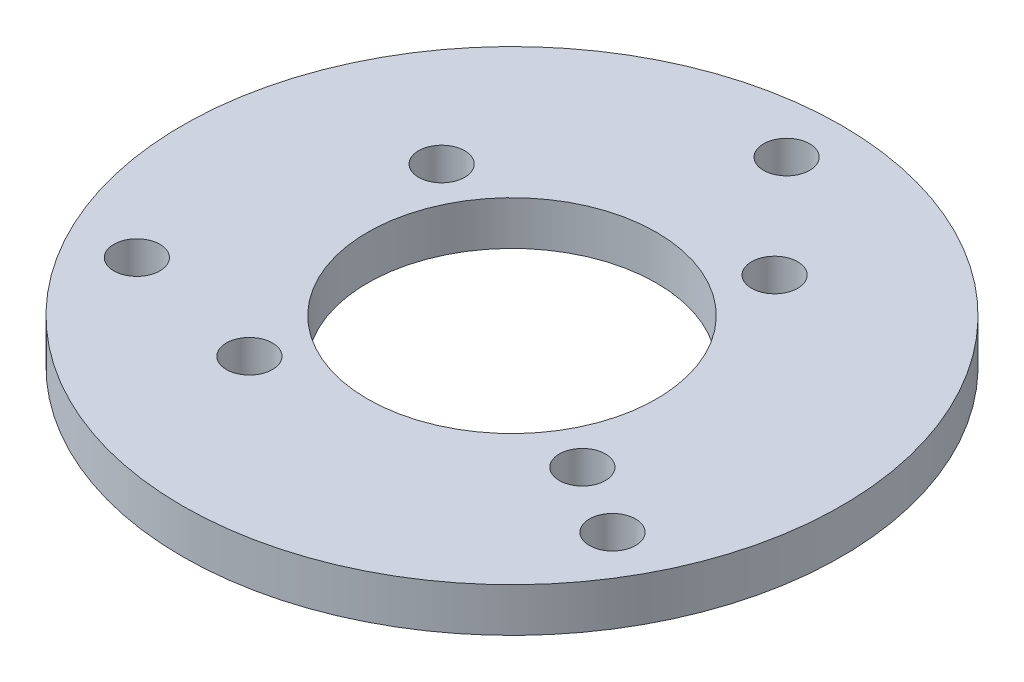
ISO-10303-21;
HEADER;
FILE_DESCRIPTION(('STEP AP214'),'2;1');
FILE_NAME('part.step','',(''),(''),'','','');
FILE_SCHEMA(('AUTOMOTIVE_DESIGN { 1 0 10303 214 1 1 1 1 }'));
ENDSEC;
DATA;
#1=APPLICATION_CONTEXT('core data for automotive mechanical design processes');
#2=APPLICATION_PROTOCOL_DEFINITION('international standard','automotive_design',2000,#1);
#3=PRODUCT_CONTEXT('',#1,'mechanical');
#4=PRODUCT('Part','Part','',(#3));
#5=PRODUCT_RELATED_PRODUCT_CATEGORY('part','',(#4));
#6=PRODUCT_DEFINITION_FORMATION('','',#4);
#7=PRODUCT_DEFINITION_CONTEXT('part definition',#1,'design');
#8=PRODUCT_DEFINITION('design','',#6,#7);
#9=PRODUCT_DEFINITION_SHAPE('','',#8);
#10=(LENGTH_UNIT() NAMED_UNIT(*) SI_UNIT(.MILLI.,.METRE.));
#11=(NAMED_UNIT(*) PLANE_ANGLE_UNIT() SI_UNIT($,.RADIAN.));
#12=(NAMED_UNIT(*) SI_UNIT($,.STERADIAN.) SOLID_ANGLE_UNIT());
#13=UNCERTAINTY_MEASURE_WITH_UNIT(LENGTH_MEASURE(1.E-05),#10,'distance_accuracy_value','');
#14=(GEOMETRIC_REPRESENTATION_CONTEXT(3) GLOBAL_UNCERTAINTY_ASSIGNED_CONTEXT((#13)) GLOBAL_UNIT_ASSIGNED_CONTEXT((#10,
#11,#12)) REPRESENTATION_CONTEXT('',''));
#15=CARTESIAN_POINT('',(0.,0.,0.));
#16=DIRECTION('',(0.,0.,1.));
#17=DIRECTION('',(1.,0.,0.));
#18=AXIS2_PLACEMENT_3D('',#15,#16,#17);
#19=CARTESIAN_POINT('',(0.,4.,0.));
#20=DIRECTION('',(0.,-1.,0.));
#21=DIRECTION('',(0.,0.,-1.));
#22=AXIS2_PLACEMENT_3D('',#19,#20,#21);
#23=CYLINDRICAL_SURFACE('',#22,30.);
#24=CARTESIAN_POINT('',(0.,4.,0.));
#25=DIRECTION('',(0.,1.,0.));
#26=DIRECTION('',(0.,0.,1.));
#27=AXIS2_PLACEMENT_3D('',#24,#25,#26);
#28=CIRCLE('',#27,30.);
#29=CARTESIAN_POINT('',(0.,4.,30.));
#30=VERTEX_POINT('',#29);
#31=EDGE_CURVE('E10',#30,#30,#28,.T.);
#32=ORIENTED_EDGE('',*,*,#31,.F.);
#33=EDGE_LOOP('',(#32));
#34=FACE_BOUND('',#33,.T.);
#35=CARTESIAN_POINT('',(0.,0.,0.));
#36=DIRECTION('',(0.,1.,0.));
#37=DIRECTION('',(0.,0.,1.));
#38=AXIS2_PLACEMENT_3D('',#35,#36,#37);
#39=CIRCLE('',#38,30.);
#40=CARTESIAN_POINT('',(0.,0.,30.));
#41=VERTEX_POINT('',#40);
#42=EDGE_CURVE('E40',#41,#41,#39,.T.);
#43=ORIENTED_EDGE('',*,*,#42,.T.);
#44=EDGE_LOOP('',(#43));
#45=FACE_BOUND('',#44,.T.);
#46=ADVANCED_FACE('F33',(#34,#45),#23,.T.);
#47=CARTESIAN_POINT('',(0.,4.,0.));
#48=DIRECTION('',(0.,1.,0.));
#49=DIRECTION('',(0.,0.,1.));
#50=AXIS2_PLACEMENT_3D('',#47,#48,#49);
#51=PLANE('',#50);
#52=CARTESIAN_POINT('',(8.75000000000002,4.,-15.1554445662277));
#53=DIRECTION('',(0.,1.,0.));
#54=DIRECTION('',(1.,0.,0.));
#55=AXIS2_PLACEMENT_3D('',#52,#53,#54);
#56=CIRCLE('',#55,2.1);
#57=CARTESIAN_POINT('',(10.85,4.,-15.1554445662277));
#58=VERTEX_POINT('',#57);
#59=EDGE_CURVE('E63',#58,#58,#56,.T.);
#60=ORIENTED_EDGE('',*,*,#59,.F.);
#61=EDGE_LOOP('',(#60));
#62=FACE_BOUND('',#61,.T.);
#63=CARTESIAN_POINT('',(-15.1554445662276,4.,-8.75000000000007));
#64=DIRECTION('',(0.,1.,0.));
#65=DIRECTION('',(0.,0.,-1.));
#66=AXIS2_PLACEMENT_3D('',#63,#64,#65);
#67=CIRCLE('',#66,2.1);
#68=CARTESIAN_POINT('',(-15.1554445662276,4.,-10.8500000000001));
#69=VERTEX_POINT('',#68);
#70=EDGE_CURVE('E144',#69,#69,#67,.T.);
#71=ORIENTED_EDGE('',*,*,#70,.F.);
#72=EDGE_LOOP('',(#71));
#73=FACE_BOUND('',#72,.T.);
#74=CARTESIAN_POINT('',(-8.74999999999991,4.,15.1554445662277));
#75=DIRECTION('',(0.,1.,0.));
#76=DIRECTION('',(-1.,0.,0.));
#77=AXIS2_PLACEMENT_3D('',#74,#75,#76);
#78=CIRCLE('',#77,2.1);
#79=CARTESIAN_POINT('',(-10.8499999999999,4.,15.1554445662278));
#80=VERTEX_POINT('',#79);
#81=EDGE_CURVE('E76',#80,#80,#78,.T.);
#82=ORIENTED_EDGE('',*,*,#81,.F.);
#83=EDGE_LOOP('',(#82));
#84=FACE_BOUND('',#83,.T.);
#85=CARTESIAN_POINT('',(15.1554445662276,4.,8.75000000000007));
#86=DIRECTION('',(0.,1.,0.));
#87=DIRECTION('',(0.,0.,1.));
#88=AXIS2_PLACEMENT_3D('',#85,#86,#87);
#89=CIRCLE('',#88,2.1);
#90=CARTESIAN_POINT('',(15.1554445662276,4.,10.8500000000001));
#91=VERTEX_POINT('',#90);
#92=EDGE_CURVE('E59',#91,#91,#89,.T.);
#93=ORIENTED_EDGE('',*,*,#92,.F.);
#94=EDGE_LOOP('',(#93));
#95=FACE_BOUND('',#94,.T.);
#96=CARTESIAN_POINT('',(0.,4.,0.));
#97=DIRECTION('',(0.,1.,0.));
#98=DIRECTION('',(0.,0.,1.));
#99=AXIS2_PLACEMENT_3D('',#96,#97,#98);
#100=CIRCLE('',#99,13.15);
#101=CARTESIAN_POINT('',(0.,4.,13.15));
#102=VERTEX_POINT('',#101);
#103=EDGE_CURVE('E55',#102,#102,#100,.T.);
#104=ORIENTED_EDGE('',*,*,#103,.F.);
#105=EDGE_LOOP('',(#104));
#106=FACE_BOUND('',#105,.T.);
#107=CARTESIAN_POINT('',(21.6506350946109,4.,12.5000000000001));
#108=DIRECTION('',(0.,1.,0.));
#109=DIRECTION('',(-0.866025403784436,0.,-0.500000000000004));
#110=AXIS2_PLACEMENT_3D('',#107,#108,#109);
#111=CIRCLE('',#110,2.1);
#112=CARTESIAN_POINT('',(19.8319817466636,4.,11.4500000000001));
#113=VERTEX_POINT('',#112);
#114=EDGE_CURVE('E83',#113,#113,#111,.T.);
#115=ORIENTED_EDGE('',*,*,#114,.F.);
#116=EDGE_LOOP('',(#115));
#117=FACE_BOUND('',#116,.T.);
#118=CARTESIAN_POINT('',(-21.6506350946111,4.,12.4999999999998));
#119=DIRECTION('',(0.,1.,0.));
#120=DIRECTION('',(0.866025403784443,0.,-0.499999999999992));
#121=AXIS2_PLACEMENT_3D('',#118,#119,#120);
#122=CIRCLE('',#121,2.1);
#123=CARTESIAN_POINT('',(-19.8319817466638,4.,11.4499999999998));
#124=VERTEX_POINT('',#123);
#125=EDGE_CURVE('E54',#124,#124,#122,.T.);
#126=ORIENTED_EDGE('',*,*,#125,.F.);
#127=EDGE_LOOP('',(#126));
#128=FACE_BOUND('',#127,.T.);
#129=CARTESIAN_POINT('',(0.,4.,-25.));
#130=DIRECTION('',(0.,1.,0.));
#131=DIRECTION('',(0.,0.,1.));
#132=AXIS2_PLACEMENT_3D('',#129,#130,#131);
#133=CIRCLE('',#132,2.1);
#134=CARTESIAN_POINT('',(0.,4.,-22.9));
#135=VERTEX_POINT('',#134);
#136=EDGE_CURVE('E48',#135,#135,#133,.T.);
#137=ORIENTED_EDGE('',*,*,#136,.F.);
#138=EDGE_LOOP('',(#137));
#139=FACE_BOUND('',#138,.T.);
#140=ORIENTED_EDGE('',*,*,#31,.T.);
#141=EDGE_LOOP('',(#140));
#142=FACE_BOUND('',#141,.T.);
#143=ADVANCED_FACE('F98',(#62,#73,#84,#95,#106,#117,#128,#139,#142),#51,.T.);
#144=CARTESIAN_POINT('',(0.,0.,0.));
#145=DIRECTION('',(0.,1.,0.));
#146=DIRECTION('',(0.,0.,1.));
#147=AXIS2_PLACEMENT_3D('',#144,#145,#146);
#148=PLANE('',#147);
#149=CARTESIAN_POINT('',(8.75000000000002,0.,-15.1554445662277));
#150=DIRECTION('',(0.,1.,0.));
#151=DIRECTION('',(0.,0.,1.));
#152=AXIS2_PLACEMENT_3D('',#149,#150,#151);
#153=CIRCLE('',#152,2.1);
#154=CARTESIAN_POINT('',(8.75000000000002,0.,-13.0554445662277));
#155=VERTEX_POINT('',#154);
#156=EDGE_CURVE('E36',#155,#155,#153,.T.);
#157=ORIENTED_EDGE('',*,*,#156,.T.);
#158=EDGE_LOOP('',(#157));
#159=FACE_BOUND('',#158,.T.);
#160=CARTESIAN_POINT('',(-15.1554445662276,0.,-8.75000000000007));
#161=DIRECTION('',(0.,1.,0.));
#162=DIRECTION('',(0.,0.,1.));
#163=AXIS2_PLACEMENT_3D('',#160,#161,#162);
#164=CIRCLE('',#163,2.1);
#165=CARTESIAN_POINT('',(-15.1554445662276,0.,-6.65000000000007));
#166=VERTEX_POINT('',#165);
#167=EDGE_CURVE('E62',#166,#166,#164,.T.);
#168=ORIENTED_EDGE('',*,*,#167,.T.);
#169=EDGE_LOOP('',(#168));
#170=FACE_BOUND('',#169,.T.);
#171=CARTESIAN_POINT('',(-8.74999999999991,0.,15.1554445662277));
#172=DIRECTION('',(0.,1.,0.));
#173=DIRECTION('',(0.,0.,1.));
#174=AXIS2_PLACEMENT_3D('',#171,#172,#173);
#175=CIRCLE('',#174,2.1);
#176=CARTESIAN_POINT('',(-8.74999999999991,0.,17.2554445662277));
#177=VERTEX_POINT('',#176);
#178=EDGE_CURVE('E60',#177,#177,#175,.T.);
#179=ORIENTED_EDGE('',*,*,#178,.T.);
#180=EDGE_LOOP('',(#179));
#181=FACE_BOUND('',#180,.T.);
#182=CARTESIAN_POINT('',(15.1554445662276,0.,8.75000000000007));
#183=DIRECTION('',(0.,1.,0.));
#184=DIRECTION('',(0.,0.,1.));
#185=AXIS2_PLACEMENT_3D('',#182,#183,#184);
#186=CIRCLE('',#185,2.1);
#187=CARTESIAN_POINT('',(15.1554445662276,0.,10.8500000000001));
#188=VERTEX_POINT('',#187);
#189=EDGE_CURVE('E56',#188,#188,#186,.T.);
#190=ORIENTED_EDGE('',*,*,#189,.T.);
#191=EDGE_LOOP('',(#190));
#192=FACE_BOUND('',#191,.T.);
#193=CARTESIAN_POINT('',(0.,0.,0.));
#194=DIRECTION('',(0.,1.,0.));
#195=DIRECTION('',(0.,0.,1.));
#196=AXIS2_PLACEMENT_3D('',#193,#194,#195);
#197=CIRCLE('',#196,13.15);
#198=CARTESIAN_POINT('',(0.,0.,13.15));
#199=VERTEX_POINT('',#198);
#200=EDGE_CURVE('E51',#199,#199,#197,.T.);
#201=ORIENTED_EDGE('',*,*,#200,.T.);
#202=EDGE_LOOP('',(#201));
#203=FACE_BOUND('',#202,.T.);
#204=CARTESIAN_POINT('',(21.6506350946109,0.,12.5000000000001));
#205=DIRECTION('',(0.,1.,0.));
#206=DIRECTION('',(-0.866025403784436,0.,-0.500000000000004));
#207=AXIS2_PLACEMENT_3D('',#204,#205,#206);
#208=CIRCLE('',#207,2.1);
#209=CARTESIAN_POINT('',(19.8319817466636,0.,11.4500000000001));
#210=VERTEX_POINT('',#209);
#211=EDGE_CURVE('E80',#210,#210,#208,.T.);
#212=ORIENTED_EDGE('',*,*,#211,.T.);
#213=EDGE_LOOP('',(#212));
#214=FACE_BOUND('',#213,.T.);
#215=CARTESIAN_POINT('',(-21.6506350946111,0.,12.4999999999998));
#216=DIRECTION('',(0.,1.,0.));
#217=DIRECTION('',(0.866025403784443,0.,-0.499999999999992));
#218=AXIS2_PLACEMENT_3D('',#215,#216,#217);
#219=CIRCLE('',#218,2.1);
#220=CARTESIAN_POINT('',(-19.8319817466638,0.,11.4499999999998));
#221=VERTEX_POINT('',#220);
#222=EDGE_CURVE('E86',#221,#221,#219,.T.);
#223=ORIENTED_EDGE('',*,*,#222,.T.);
#224=EDGE_LOOP('',(#223));
#225=FACE_BOUND('',#224,.T.);
#226=CARTESIAN_POINT('',(0.,0.,-25.));
#227=DIRECTION('',(0.,1.,0.));
#228=DIRECTION('',(0.,0.,1.));
#229=AXIS2_PLACEMENT_3D('',#226,#227,#228);
#230=CIRCLE('',#229,2.1);
#231=CARTESIAN_POINT('',(0.,0.,-22.9));
#232=VERTEX_POINT('',#231);
#233=EDGE_CURVE('E45',#232,#232,#230,.T.);
#234=ORIENTED_EDGE('',*,*,#233,.T.);
#235=EDGE_LOOP('',(#234));
#236=FACE_BOUND('',#235,.T.);
#237=ORIENTED_EDGE('',*,*,#42,.F.);
#238=EDGE_LOOP('',(#237));
#239=FACE_BOUND('',#238,.T.);
#240=ADVANCED_FACE('F100',(#159,#170,#181,#192,#203,#214,#225,#236,#239),#148,.F.);
#241=CARTESIAN_POINT('',(0.,0.,-25.));
#242=DIRECTION('',(0.,1.,0.));
#243=DIRECTION('',(0.,0.,1.));
#244=AXIS2_PLACEMENT_3D('',#241,#242,#243);
#245=CYLINDRICAL_SURFACE('',#244,2.1);
#246=ORIENTED_EDGE('',*,*,#233,.F.);
#247=EDGE_LOOP('',(#246));
#248=FACE_BOUND('',#247,.T.);
#249=ORIENTED_EDGE('',*,*,#136,.T.);
#250=EDGE_LOOP('',(#249));
#251=FACE_BOUND('',#250,.T.);
#252=ADVANCED_FACE('F96',(#248,#251),#245,.F.);
#253=CARTESIAN_POINT('',(-21.6506350946111,0.,12.4999999999998));
#254=DIRECTION('',(0.,1.,0.));
#255=DIRECTION('',(0.,0.,1.));
#256=AXIS2_PLACEMENT_3D('',#253,#254,#255);
#257=CYLINDRICAL_SURFACE('',#256,2.1);
#258=ORIENTED_EDGE('',*,*,#222,.F.);
#259=EDGE_LOOP('',(#258));
#260=FACE_BOUND('',#259,.T.);
#261=ORIENTED_EDGE('',*,*,#125,.T.);
#262=EDGE_LOOP('',(#261));
#263=FACE_BOUND('',#262,.T.);
#264=ADVANCED_FACE('F113',(#260,#263),#257,.F.);
#265=CARTESIAN_POINT('',(21.6506350946109,0.,12.5000000000001));
#266=DIRECTION('',(0.,1.,0.));
#267=DIRECTION('',(0.,0.,1.));
#268=AXIS2_PLACEMENT_3D('',#265,#266,#267);
#269=CYLINDRICAL_SURFACE('',#268,2.1);
#270=ORIENTED_EDGE('',*,*,#211,.F.);
#271=EDGE_LOOP('',(#270));
#272=FACE_BOUND('',#271,.T.);
#273=ORIENTED_EDGE('',*,*,#114,.T.);
#274=EDGE_LOOP('',(#273));
#275=FACE_BOUND('',#274,.T.);
#276=ADVANCED_FACE('F117',(#272,#275),#269,.F.);
#277=CARTESIAN_POINT('',(0.,-13.,0.));
#278=DIRECTION('',(0.,1.,0.));
#279=DIRECTION('',(0.,0.,1.));
#280=AXIS2_PLACEMENT_3D('',#277,#278,#279);
#281=CYLINDRICAL_SURFACE('',#280,13.15);
#282=ORIENTED_EDGE('',*,*,#103,.T.);
#283=EDGE_LOOP('',(#282));
#284=FACE_BOUND('',#283,.T.);
#285=ORIENTED_EDGE('',*,*,#200,.F.);
#286=EDGE_LOOP('',(#285));
#287=FACE_BOUND('',#286,.T.);
#288=ADVANCED_FACE('F121',(#284,#287),#281,.F.);
#289=CARTESIAN_POINT('',(15.1554445662276,-13.,8.75000000000007));
#290=DIRECTION('',(0.,1.,0.));
#291=DIRECTION('',(0.,0.,1.));
#292=AXIS2_PLACEMENT_3D('',#289,#290,#291);
#293=CYLINDRICAL_SURFACE('',#292,2.1);
#294=ORIENTED_EDGE('',*,*,#92,.T.);
#295=EDGE_LOOP('',(#294));
#296=FACE_BOUND('',#295,.T.);
#297=ORIENTED_EDGE('',*,*,#189,.F.);
#298=EDGE_LOOP('',(#297));
#299=FACE_BOUND('',#298,.T.);
#300=ADVANCED_FACE('F125',(#296,#299),#293,.F.);
#301=CARTESIAN_POINT('',(-8.74999999999991,-13.,15.1554445662277));
#302=DIRECTION('',(0.,1.,0.));
#303=DIRECTION('',(0.,0.,1.));
#304=AXIS2_PLACEMENT_3D('',#301,#302,#303);
#305=CYLINDRICAL_SURFACE('',#304,2.1);
#306=ORIENTED_EDGE('',*,*,#81,.T.);
#307=EDGE_LOOP('',(#306));
#308=FACE_BOUND('',#307,.T.);
#309=ORIENTED_EDGE('',*,*,#178,.F.);
#310=EDGE_LOOP('',(#309));
#311=FACE_BOUND('',#310,.T.);
#312=ADVANCED_FACE('F129',(#308,#311),#305,.F.);
#313=CARTESIAN_POINT('',(-15.1554445662276,-13.,-8.75000000000007));
#314=DIRECTION('',(0.,1.,0.));
#315=DIRECTION('',(0.,0.,1.));
#316=AXIS2_PLACEMENT_3D('',#313,#314,#315);
#317=CYLINDRICAL_SURFACE('',#316,2.1);
#318=ORIENTED_EDGE('',*,*,#70,.T.);
#319=EDGE_LOOP('',(#318));
#320=FACE_BOUND('',#319,.T.);
#321=ORIENTED_EDGE('',*,*,#167,.F.);
#322=EDGE_LOOP('',(#321));
#323=FACE_BOUND('',#322,.T.);
#324=ADVANCED_FACE('F132',(#320,#323),#317,.F.);
#325=CARTESIAN_POINT('',(8.75000000000002,-13.,-15.1554445662277));
#326=DIRECTION('',(0.,1.,0.));
#327=DIRECTION('',(0.,0.,1.));
#328=AXIS2_PLACEMENT_3D('',#325,#326,#327);
#329=CYLINDRICAL_SURFACE('',#328,2.1);
#330=ORIENTED_EDGE('',*,*,#59,.T.);
#331=EDGE_LOOP('',(#330));
#332=FACE_BOUND('',#331,.T.);
#333=ORIENTED_EDGE('',*,*,#156,.F.);
#334=EDGE_LOOP('',(#333));
#335=FACE_BOUND('',#334,.T.);
#336=ADVANCED_FACE('F136',(#332,#335),#329,.F.);
#337=CLOSED_SHELL('',(#46,#143,#240,#252,#264,#276,#288,#300,#312,#324,#336));
#338=MANIFOLD_SOLID_BREP('B2',#337);
#339=ADVANCED_BREP_SHAPE_REPRESENTATION('',(#18,#338),#14);
#340=SHAPE_DEFINITION_REPRESENTATION(#9,#339);
ENDSEC;
END-ISO-10303-21;
